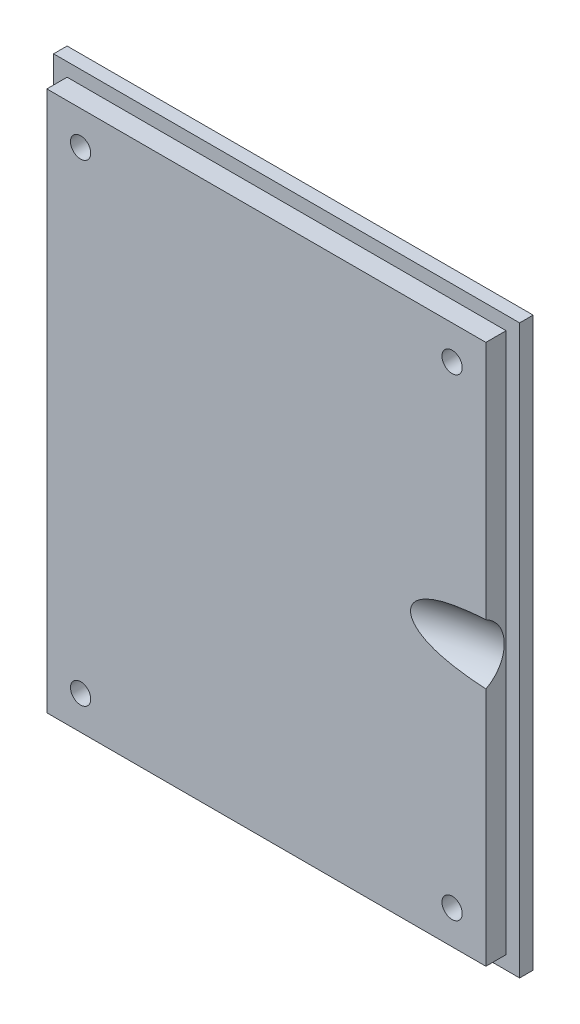
ISO-10303-21;
HEADER;
FILE_DESCRIPTION(('STEP AP214'),'2;1');
FILE_NAME('part.step','',(''),(''),'','','');
FILE_SCHEMA(('AUTOMOTIVE_DESIGN { 1 0 10303 214 1 1 1 1 }'));
ENDSEC;
DATA;
#1=APPLICATION_CONTEXT('core data for automotive mechanical design processes');
#2=APPLICATION_PROTOCOL_DEFINITION('international standard','automotive_design',2000,#1);
#3=PRODUCT_CONTEXT('',#1,'mechanical');
#4=PRODUCT('Part','Part','',(#3));
#5=PRODUCT_RELATED_PRODUCT_CATEGORY('part','',(#4));
#6=PRODUCT_DEFINITION_FORMATION('','',#4);
#7=PRODUCT_DEFINITION_CONTEXT('part definition',#1,'design');
#8=PRODUCT_DEFINITION('design','',#6,#7);
#9=PRODUCT_DEFINITION_SHAPE('','',#8);
#10=(LENGTH_UNIT() NAMED_UNIT(*) SI_UNIT(.MILLI.,.METRE.));
#11=(NAMED_UNIT(*) PLANE_ANGLE_UNIT() SI_UNIT($,.RADIAN.));
#12=(NAMED_UNIT(*) SI_UNIT($,.STERADIAN.) SOLID_ANGLE_UNIT());
#13=UNCERTAINTY_MEASURE_WITH_UNIT(LENGTH_MEASURE(1.E-05),#10,'distance_accuracy_value','');
#14=(GEOMETRIC_REPRESENTATION_CONTEXT(3) GLOBAL_UNCERTAINTY_ASSIGNED_CONTEXT((#13)) GLOBAL_UNIT_ASSIGNED_CONTEXT((#10,
#11,#12)) REPRESENTATION_CONTEXT('',''));
#15=CARTESIAN_POINT('',(0.,0.,0.));
#16=DIRECTION('',(0.,0.,1.));
#17=DIRECTION('',(1.,0.,0.));
#18=AXIS2_PLACEMENT_3D('',#15,#16,#17);
#19=CARTESIAN_POINT('',(-32.5,-40.,5.));
#20=DIRECTION('',(0.,1.,0.));
#21=DIRECTION('',(0.,0.,1.));
#22=AXIS2_PLACEMENT_3D('',#19,#20,#21);
#23=PLANE('',#22);
#24=DIRECTION('',(0.,0.,-1.));
#25=VECTOR('',#24,1.);
#26=CARTESIAN_POINT('',(-32.5,-40.,5.));
#27=LINE('',#26,#25);
#28=CARTESIAN_POINT('',(-32.5,-40.,5.));
#29=VERTEX_POINT('',#28);
#30=CARTESIAN_POINT('',(-32.5,-40.,2.));
#31=VERTEX_POINT('',#30);
#32=EDGE_CURVE('E146',#29,#31,#27,.T.);
#33=ORIENTED_EDGE('',*,*,#32,.T.);
#34=DIRECTION('',(1.,0.,0.));
#35=VECTOR('',#34,1.);
#36=CARTESIAN_POINT('',(0.,-40.,2.));
#37=LINE('',#36,#35);
#38=CARTESIAN_POINT('',(32.5,-40.,2.));
#39=VERTEX_POINT('',#38);
#40=EDGE_CURVE('E71',#31,#39,#37,.T.);
#41=ORIENTED_EDGE('',*,*,#40,.T.);
#42=DIRECTION('',(0.,0.,-1.));
#43=VECTOR('',#42,1.);
#44=CARTESIAN_POINT('',(32.5,-40.,5.));
#45=LINE('',#44,#43);
#46=CARTESIAN_POINT('',(32.5,-40.,5.));
#47=VERTEX_POINT('',#46);
#48=EDGE_CURVE('E58',#47,#39,#45,.T.);
#49=ORIENTED_EDGE('',*,*,#48,.F.);
#50=DIRECTION('',(1.,0.,0.));
#51=VECTOR('',#50,1.);
#52=CARTESIAN_POINT('',(-32.5,-40.,5.));
#53=LINE('',#52,#51);
#54=EDGE_CURVE('E135',#29,#47,#53,.T.);
#55=ORIENTED_EDGE('',*,*,#54,.F.);
#56=EDGE_LOOP('',(#33,#41,#49,#55));
#57=FACE_BOUND('',#56,.T.);
#58=ADVANCED_FACE('F45',(#57),#23,.F.);
#59=CARTESIAN_POINT('',(32.5,-40.,5.));
#60=DIRECTION('',(-1.,0.,0.));
#61=DIRECTION('',(0.,-1.,0.));
#62=AXIS2_PLACEMENT_3D('',#59,#60,#61);
#63=PLANE('',#62);
#64=DIRECTION('',(0.,1.,0.));
#65=VECTOR('',#64,1.);
#66=CARTESIAN_POINT('',(32.5,-40.,5.));
#67=LINE('',#66,#65);
#68=CARTESIAN_POINT('',(32.5,4.44136884406779,5.));
#69=VERTEX_POINT('',#68);
#70=CARTESIAN_POINT('',(32.5,40.,5.));
#71=VERTEX_POINT('',#70);
#72=EDGE_CURVE('E128',#69,#71,#67,.T.);
#73=ORIENTED_EDGE('',*,*,#72,.F.);
#74=CARTESIAN_POINT('',(32.4999979757134,-3.516874652611,3.73385346071111));
#75=CARTESIAN_POINT('',(32.4999981249475,-3.6171821269882,3.8337699571446));
#76=CARTESIAN_POINT('',(32.4999994974993,-3.7132428965186,3.93792892344822));
#77=CARTESIAN_POINT('',(32.500000502642,-3.89625520266674,4.15402293486602));
#78=CARTESIAN_POINT('',(32.5000001347436,-3.98320417056387,4.26596015804758));
#79=CARTESIAN_POINT('',(32.4999998651276,-4.14742708099092,4.496878385669));
#80=CARTESIAN_POINT('',(32.4999999638562,-4.22469169243426,4.61586602325403));
#81=CARTESIAN_POINT('',(32.5000000361572,-4.36894436788852,4.85997491381459));
#82=CARTESIAN_POINT('',(32.5000000096833,-4.43592862402899,4.98509841699587));
#83=CARTESIAN_POINT('',(32.4999999903277,-4.55905714962186,5.2403939297611));
#84=CARTESIAN_POINT('',(32.4999999974079,-4.61521363309605,5.37056004963592));
#85=CARTESIAN_POINT('',(32.500000002593,-4.71642011367928,5.63519528130909));
#86=CARTESIAN_POINT('',(32.5000000006946,-4.76146601359968,5.76966595988538));
#87=CARTESIAN_POINT('',(32.4999999993058,-4.84009834812408,6.04182569298067));
#88=CARTESIAN_POINT('',(32.4999999998139,-4.87369190753094,6.17951268935695));
#89=CARTESIAN_POINT('',(32.5000000001861,-4.92924710919243,6.45726628272309));
#90=CARTESIAN_POINT('',(32.50000000005,-4.95120443783057,6.59733374233348));
#91=CARTESIAN_POINT('',(32.4999999999498,-4.98339622805315,6.87942798304581));
#92=CARTESIAN_POINT('',(32.4999999999865,-4.99357919148764,7.02146064224516));
#93=CARTESIAN_POINT('',(32.5000000000135,-5.00198786039795,7.30593171991061));
#94=CARTESIAN_POINT('',(32.5000000000036,-5.00020914278654,7.44837026900074));
#95=CARTESIAN_POINT('',(32.4999999999964,-4.98470443122162,7.73255246145232));
#96=CARTESIAN_POINT('',(32.499999999999,-4.97098204326742,7.87429630157017));
#97=CARTESIAN_POINT('',(32.500000000001,-4.93168606138697,8.15618479384486));
#98=CARTESIAN_POINT('',(32.5000000000003,-4.90610808724715,8.29632883530815));
#99=CARTESIAN_POINT('',(32.4999999999997,-4.84317666000906,8.57441673210747));
#100=CARTESIAN_POINT('',(32.4999999999999,-4.80578607785502,8.712352189179));
#101=CARTESIAN_POINT('',(32.5000000000001,-4.71950024667184,8.98463022938432));
#102=CARTESIAN_POINT('',(32.5,-4.67060073645046,9.11897146118568));
#103=CARTESIAN_POINT('',(32.5,-4.56165242832222,9.38300852188289));
#104=CARTESIAN_POINT('',(32.5,-4.50160770485095,9.51270602781528));
#105=CARTESIAN_POINT('',(32.5,-4.37078178578848,9.7665841465862));
#106=CARTESIAN_POINT('',(32.5,-4.29999664458931,9.89076271021739));
#107=CARTESIAN_POINT('',(32.5,-4.07248787128145,10.253188966385));
#108=CARTESIAN_POINT('',(32.5,-3.90032848673595,10.4820101269757));
#109=CARTESIAN_POINT('',(32.5,-3.51988267372951,10.9071225556019));
#110=CARTESIAN_POINT('',(32.5,-3.31159748826072,11.1034149424112));
#111=CARTESIAN_POINT('',(32.5,-2.86621412310481,11.4565788559539));
#112=CARTESIAN_POINT('',(32.5,-2.62932384459324,11.6137120850903));
#113=CARTESIAN_POINT('',(32.5,-2.13233243378857,11.8855244579747));
#114=CARTESIAN_POINT('',(32.5,-1.87223257436095,12.0002059280987));
#115=CARTESIAN_POINT('',(32.5,-1.33884081874991,12.1827441174686));
#116=CARTESIAN_POINT('',(32.5,-1.06569701871864,12.2510335918701));
#117=CARTESIAN_POINT('',(32.5,-0.511798107779041,12.3404305262509));
#118=CARTESIAN_POINT('',(32.5,-0.231043356422543,12.3615402111508));
#119=CARTESIAN_POINT('',(32.5,0.32805462763993,12.3559522226046));
#120=CARTESIAN_POINT('',(32.5,0.606401190018648,12.3295815517884));
#121=CARTESIAN_POINT('',(32.5,1.15470730130728,12.2304735258888));
#122=CARTESIAN_POINT('',(32.5,1.42466692663318,12.1577365933928));
#123=CARTESIAN_POINT('',(32.5,1.94856914976691,11.9680959765911));
#124=CARTESIAN_POINT('',(32.5,2.20251278434363,11.8511951545939));
#125=CARTESIAN_POINT('',(32.5,2.6873502364433,11.5766935061829));
#126=CARTESIAN_POINT('',(32.5,2.91824335688695,11.4190914494245));
#127=CARTESIAN_POINT('',(32.5,3.35212341307692,11.0665820546904));
#128=CARTESIAN_POINT('',(32.5,3.55491266179812,10.8714314478945));
#129=CARTESIAN_POINT('',(32.5,3.92522581281354,10.4501361521947));
#130=CARTESIAN_POINT('',(32.5,4.09274796169792,10.2239899231727));
#131=CARTESIAN_POINT('',(32.5,4.38942245907388,9.74483683000219));
#132=CARTESIAN_POINT('',(32.5,4.51819931693697,9.49159745149484));
#133=CARTESIAN_POINT('',(32.5,4.73175528083807,8.96719995296679));
#134=CARTESIAN_POINT('',(32.5,4.81653251946085,8.69604107296389));
#135=CARTESIAN_POINT('',(32.5,4.94022345439426,8.14143825450735));
#136=CARTESIAN_POINT('',(32.5,4.97880888369239,7.85792105509537));
#137=CARTESIAN_POINT('',(32.5,5.00793192631867,7.28842510052362));
#138=CARTESIAN_POINT('',(32.5,4.99846869703963,7.00244630228372));
#139=CARTESIAN_POINT('',(32.5,4.9316418364214,6.43560769372061));
#140=CARTESIAN_POINT('',(32.5,4.87419098393685,6.15475815672452));
#141=CARTESIAN_POINT('',(32.5,4.71278923679523,5.60673943680414));
#142=CARTESIAN_POINT('',(32.5,4.60883893536106,5.33957007940161));
#143=CARTESIAN_POINT('',(32.5,4.35773944290128,4.82750553697763));
#144=CARTESIAN_POINT('',(32.5,4.21073425253095,4.58253961071515));
#145=CARTESIAN_POINT('',(32.5,3.87731157798399,4.12087478741439));
#146=CARTESIAN_POINT('',(32.5,3.69089525019269,3.90417506130251));
#147=CARTESIAN_POINT('',(32.5,3.38661999914296,3.60596720644367));
#148=CARTESIAN_POINT('',(32.5,3.28139333188492,3.51125102837838));
#149=CARTESIAN_POINT('',(32.5,3.06331128068612,3.33107519250852));
#150=CARTESIAN_POINT('',(32.5,2.95045881169792,3.24561202989589));
#151=CARTESIAN_POINT('',(32.5,2.71787816466228,3.08454401218533));
#152=CARTESIAN_POINT('',(32.5,2.59814759264898,3.00894261984981));
#153=CARTESIAN_POINT('',(32.5,2.35274085480321,2.86820864177198));
#154=CARTESIAN_POINT('',(32.5,2.22706695546945,2.80307210624801));
#155=CARTESIAN_POINT('',(32.5,1.97142111582366,2.68408587451887));
#156=CARTESIAN_POINT('',(32.5000000000001,1.84148016040701,2.6301695895228));
#157=CARTESIAN_POINT('',(32.4999999999999,1.57755242962669,2.53354016753895));
#158=CARTESIAN_POINT('',(32.4999999999998,1.44356720224795,2.49082280319967));
#159=CARTESIAN_POINT('',(32.5000000000002,1.17242001820544,2.41686905887265));
#160=CARTESIAN_POINT('',(32.5000000000008,1.03525708890694,2.38563624479068));
#161=CARTESIAN_POINT('',(32.4999999999992,0.758829948227324,2.33491116293828));
#162=CARTESIAN_POINT('',(32.4999999999969,0.619566541668243,2.31541450986564));
#163=CARTESIAN_POINT('',(32.5000000000031,0.3404823034997,2.28834569232074));
#164=CARTESIAN_POINT('',(32.5000000000115,0.200666340952009,2.28072330527807));
#165=CARTESIAN_POINT('',(32.4999999999885,-0.0790581208254349,2.27730165717199));
#166=CARTESIAN_POINT('',(32.4999999999571,-0.218966566102274,2.28149798808714));
#167=CARTESIAN_POINT('',(32.5000000000429,-0.498016288028657,2.30167964903476));
#168=CARTESIAN_POINT('',(32.5000000001601,-0.63715704529949,2.31767216057601));
#169=CARTESIAN_POINT('',(32.4999999998399,-0.913542688765869,2.36132855833972));
#170=CARTESIAN_POINT('',(32.4999999994027,-1.05078825315074,2.38898815155321));
#171=CARTESIAN_POINT('',(32.5000000005971,-1.3224135120005,2.45576358729008));
#172=CARTESIAN_POINT('',(32.5000000022279,-1.45679417316671,2.49487549766725));
#173=CARTESIAN_POINT('',(32.4999999977729,-1.72173714527039,2.58425587710943));
#174=CARTESIAN_POINT('',(32.4999999916899,-1.85230082810006,2.63452028055319));
#175=CARTESIAN_POINT('',(32.5000000083026,-2.10862623722175,2.74579851580137));
#176=CARTESIAN_POINT('',(32.5000000309725,-2.23439217849113,2.80680263484359));
#177=CARTESIAN_POINT('',(32.4999999690357,-2.48032355243891,2.93912397088406));
#178=CARTESIAN_POINT('',(32.4999998844575,-2.60049046278283,3.01043844621033));
#179=CARTESIAN_POINT('',(32.500000142093,-2.86133182907438,3.18041916331689));
#180=CARTESIAN_POINT('',(32.5000005868452,-3.00037348724913,3.28160491760796));
#181=CARTESIAN_POINT('',(32.499999413156,-3.26731718847826,3.49773147407023));
#182=CARTESIAN_POINT('',(32.4999977947187,-3.39521925338495,3.61267224925745));
#183=CARTESIAN_POINT('',(32.4999979757134,-3.516874652611,3.73385346071111));
#184=B_SPLINE_CURVE_WITH_KNOTS('',3,(#74,#75,#76,#77,#78,#79,#80,#81,#82,#83,#84,#85,#86,#87,
#88,#89,#90,#91,#92,#93,#94,#95,#96,#97,#98,#99,#100,#101,#102,#103,#104,#105,#106,#107,#108,
#109,#110,#111,#112,#113,#114,#115,#116,#117,#118,#119,#120,#121,#122,#123,#124,#125,#126,#127,
#128,#129,#130,#131,#132,#133,#134,#135,#136,#137,#138,#139,#140,#141,#142,#143,#144,#145,#146,
#147,#148,#149,#150,#151,#152,#153,#154,#155,#156,#157,#158,#159,#160,#161,#162,#163,#164,#165,
#166,#167,#168,#169,#170,#171,#172,#173,#174,#175,#176,#177,#178,#179,#180,#181,#182,#183),
.UNSPECIFIED.,.T.,.F.,(4,2,2,2,2,2,2,2,2,2,2,2,2,2,2,2,2,2,2,2,2,2,2,2,2,2,2,2,2,2,2,2,2,2,2,2,
2,2,2,2,2,2,2,2,2,2,2,2,2,2,2,2,2,2,4),(0.,0.424588292912044,0.849295961909985,1.2744097505481,
1.69968062437603,2.12446893800834,2.54941366506714,2.97409353829083,3.39893073281214,
3.82561911387645,4.25246528076314,4.67918262014399,5.10605774208933,5.53428818343303,
5.96267742765055,6.39091036988927,6.81930101069769,7.67389342975139,8.52845645039716,
9.37714523754839,10.2257875092746,11.0664005600881,11.9069739681497,12.7417803781225,
13.5765791796829,14.4113238863292,15.2460938291635,16.0864661760144,16.9268802946391,
17.7751945538913,18.6235448140334,19.4778888399408,20.3322478481377,21.1881631062646,
22.0440674452502,22.8971412091028,23.7501899458898,24.1745022531405,24.5986532751756,
25.0229528307041,25.4470918634611,25.8686370663418,26.2900229151164,26.7115394922082,
27.1328984686283,27.5524704085024,27.9718858815609,28.3915569055169,28.8110736422194,
29.2304465066684,29.6496667399522,30.0685097692938,30.4872416264072,31.0021938762929,
31.5171451159851),.UNSPECIFIED.);
#185=CARTESIAN_POINT('',(32.5,-4.44136884406779,5.));
#186=VERTEX_POINT('',#185);
#187=EDGE_CURVE('E63',#69,#186,#184,.T.);
#188=ORIENTED_EDGE('',*,*,#187,.T.);
#189=EDGE_CURVE('E125',#47,#186,#67,.T.);
#190=ORIENTED_EDGE('',*,*,#189,.F.);
#191=ORIENTED_EDGE('',*,*,#48,.T.);
#192=DIRECTION('',(0.,1.,0.));
#193=VECTOR('',#192,1.);
#194=CARTESIAN_POINT('',(32.5,0.,2.));
#195=LINE('',#194,#193);
#196=CARTESIAN_POINT('',(32.5,40.,2.));
#197=VERTEX_POINT('',#196);
#198=EDGE_CURVE('E153',#39,#197,#195,.T.);
#199=ORIENTED_EDGE('',*,*,#198,.T.);
#200=DIRECTION('',(0.,0.,-1.));
#201=VECTOR('',#200,1.);
#202=CARTESIAN_POINT('',(32.5,40.,5.));
#203=LINE('',#202,#201);
#204=EDGE_CURVE('E150',#71,#197,#203,.T.);
#205=ORIENTED_EDGE('',*,*,#204,.F.);
#206=EDGE_LOOP('',(#73,#188,#190,#191,#199,#205));
#207=FACE_BOUND('',#206,.T.);
#208=ADVANCED_FACE('F124',(#207),#63,.F.);
#209=CARTESIAN_POINT('',(-32.5,40.,5.));
#210=DIRECTION('',(0.,1.,0.));
#211=DIRECTION('',(-1.,0.,0.));
#212=AXIS2_PLACEMENT_3D('',#209,#210,#211);
#213=PLANE('',#212);
#214=DIRECTION('',(1.,0.,0.));
#215=VECTOR('',#214,1.);
#216=CARTESIAN_POINT('',(0.,40.,2.));
#217=LINE('',#216,#215);
#218=CARTESIAN_POINT('',(-32.5,40.,2.));
#219=VERTEX_POINT('',#218);
#220=EDGE_CURVE('E160',#219,#197,#217,.T.);
#221=ORIENTED_EDGE('',*,*,#220,.F.);
#222=DIRECTION('',(0.,0.,-1.));
#223=VECTOR('',#222,1.);
#224=CARTESIAN_POINT('',(-32.5,40.,5.));
#225=LINE('',#224,#223);
#226=CARTESIAN_POINT('',(-32.5,40.,5.));
#227=VERTEX_POINT('',#226);
#228=EDGE_CURVE('E148',#227,#219,#225,.T.);
#229=ORIENTED_EDGE('',*,*,#228,.F.);
#230=DIRECTION('',(1.,0.,0.));
#231=VECTOR('',#230,1.);
#232=CARTESIAN_POINT('',(-32.5,40.,5.));
#233=LINE('',#232,#231);
#234=EDGE_CURVE('E136',#227,#71,#233,.T.);
#235=ORIENTED_EDGE('',*,*,#234,.T.);
#236=ORIENTED_EDGE('',*,*,#204,.T.);
#237=EDGE_LOOP('',(#221,#229,#235,#236));
#238=FACE_BOUND('',#237,.T.);
#239=ADVANCED_FACE('F226',(#238),#213,.T.);
#240=CARTESIAN_POINT('',(-32.5,-40.,5.));
#241=DIRECTION('',(-1.,0.,0.));
#242=DIRECTION('',(0.,0.,1.));
#243=AXIS2_PLACEMENT_3D('',#240,#241,#242);
#244=PLANE('',#243);
#245=DIRECTION('',(0.,1.,0.));
#246=VECTOR('',#245,1.);
#247=CARTESIAN_POINT('',(-32.5,0.,2.));
#248=LINE('',#247,#246);
#249=EDGE_CURVE('E166',#31,#219,#248,.T.);
#250=ORIENTED_EDGE('',*,*,#249,.F.);
#251=ORIENTED_EDGE('',*,*,#32,.F.);
#252=DIRECTION('',(0.,1.,0.));
#253=VECTOR('',#252,1.);
#254=CARTESIAN_POINT('',(-32.5,-40.,5.));
#255=LINE('',#254,#253);
#256=EDGE_CURVE('E139',#29,#227,#255,.T.);
#257=ORIENTED_EDGE('',*,*,#256,.T.);
#258=ORIENTED_EDGE('',*,*,#228,.T.);
#259=EDGE_LOOP('',(#250,#251,#257,#258));
#260=FACE_BOUND('',#259,.T.);
#261=ADVANCED_FACE('F228',(#260),#244,.T.);
#262=CARTESIAN_POINT('',(0.,0.,5.));
#263=DIRECTION('',(0.,0.,1.));
#264=DIRECTION('',(1.,0.,0.));
#265=AXIS2_PLACEMENT_3D('',#262,#263,#264);
#266=PLANE('',#265);
#267=CARTESIAN_POINT('',(27.5,-35.,5.));
#268=DIRECTION('',(0.,0.,1.));
#269=DIRECTION('',(1.,0.,0.));
#270=AXIS2_PLACEMENT_3D('',#267,#268,#269);
#271=CIRCLE('',#270,1.5);
#272=CARTESIAN_POINT('',(29.,-35.,5.));
#273=VERTEX_POINT('',#272);
#274=EDGE_CURVE('E130',#273,#273,#271,.T.);
#275=ORIENTED_EDGE('',*,*,#274,.F.);
#276=EDGE_LOOP('',(#275));
#277=FACE_BOUND('',#276,.T.);
#278=CARTESIAN_POINT('',(-27.5,-35.,5.));
#279=DIRECTION('',(0.,0.,1.));
#280=DIRECTION('',(1.,0.,0.));
#281=AXIS2_PLACEMENT_3D('',#278,#279,#280);
#282=CIRCLE('',#281,1.5);
#283=CARTESIAN_POINT('',(-26.,-35.,5.));
#284=VERTEX_POINT('',#283);
#285=EDGE_CURVE('E280',#284,#284,#282,.T.);
#286=ORIENTED_EDGE('',*,*,#285,.F.);
#287=EDGE_LOOP('',(#286));
#288=FACE_BOUND('',#287,.T.);
#289=CARTESIAN_POINT('',(-27.5,35.,5.));
#290=DIRECTION('',(0.,0.,1.));
#291=DIRECTION('',(1.,0.,0.));
#292=AXIS2_PLACEMENT_3D('',#289,#290,#291);
#293=CIRCLE('',#292,1.5);
#294=CARTESIAN_POINT('',(-26.,35.,5.));
#295=VERTEX_POINT('',#294);
#296=EDGE_CURVE('E261',#295,#295,#293,.T.);
#297=ORIENTED_EDGE('',*,*,#296,.F.);
#298=EDGE_LOOP('',(#297));
#299=FACE_BOUND('',#298,.T.);
#300=CARTESIAN_POINT('',(27.5,35.,5.));
#301=DIRECTION('',(0.,0.,1.));
#302=DIRECTION('',(1.,0.,0.));
#303=AXIS2_PLACEMENT_3D('',#300,#301,#302);
#304=CIRCLE('',#303,1.5);
#305=CARTESIAN_POINT('',(29.,35.,5.));
#306=VERTEX_POINT('',#305);
#307=EDGE_CURVE('E270',#306,#306,#304,.T.);
#308=ORIENTED_EDGE('',*,*,#307,.F.);
#309=EDGE_LOOP('',(#308));
#310=FACE_BOUND('',#309,.T.);
#311=CARTESIAN_POINT('',(52.6558443707464,1.83561105481302,5.));
#312=CARTESIAN_POINT('',(52.5737148612363,1.90619296503915,5.));
#313=CARTESIAN_POINT('',(52.4891116073405,1.97378906228447,5.));
#314=CARTESIAN_POINT('',(52.3159303022378,2.10350042620041,5.));
#315=CARTESIAN_POINT('',(52.2273565479426,2.16562141190841,5.));
#316=CARTESIAN_POINT('',(52.0474172021252,2.28476354522464,5.));
#317=CARTESIAN_POINT('',(51.9560652514872,2.34180547127826,5.));
#318=CARTESIAN_POINT('',(51.7707827815188,2.45157779134348,5.));
#319=CARTESIAN_POINT('',(51.6768514957516,2.50430688488839,5.));
#320=CARTESIAN_POINT('',(51.3953402149125,2.65484632624566,5.));
#321=CARTESIAN_POINT('',(51.2047832522632,2.7471073258244,5.));
#322=CARTESIAN_POINT('',(50.8179959101407,2.9193427950116,5.));
#323=CARTESIAN_POINT('',(50.6217582303496,2.99930053761165,5.));
#324=CARTESIAN_POINT('',(50.1518571050608,3.17658771600231,5.));
#325=CARTESIAN_POINT('',(49.8764789296329,3.26935666098378,5.));
#326=CARTESIAN_POINT('',(49.3209180508561,3.43933880428353,5.));
#327=CARTESIAN_POINT('',(49.0407330852568,3.51654444717197,5.));
#328=CARTESIAN_POINT('',(48.4769069359302,3.65828179285345,5.));
#329=CARTESIAN_POINT('',(48.1932625357492,3.72280056518377,5.));
#330=CARTESIAN_POINT('',(47.6237666549316,3.84126017765177,5.));
#331=CARTESIAN_POINT('',(47.3379149194201,3.89519977666908,5.));
#332=CARTESIAN_POINT('',(46.7589300547261,3.99519609655886,5.));
#333=CARTESIAN_POINT('',(46.4657660945496,4.04107248862638,5.));
#334=CARTESIAN_POINT('',(45.878324987866,4.12503185631241,5.));
#335=CARTESIAN_POINT('',(45.5840477982942,4.16311452722889,5.));
#336=CARTESIAN_POINT('',(44.9950288541893,4.23261207999385,5.));
#337=CARTESIAN_POINT('',(44.7002879140713,4.26403393430138,5.));
#338=CARTESIAN_POINT('',(44.1102668996281,4.32120480744591,5.));
#339=CARTESIAN_POINT('',(43.8149868336445,4.34695391331725,5.));
#340=CARTESIAN_POINT('',(43.1729697092692,4.39758351356227,5.));
#341=CARTESIAN_POINT('',(42.826160616668,4.42154452292055,5.));
#342=CARTESIAN_POINT('',(42.1321889564023,4.46373215143646,5.));
#343=CARTESIAN_POINT('',(41.7850263781238,4.48195859298635,5.));
#344=CARTESIAN_POINT('',(41.090430489041,4.51344543398709,5.));
#345=CARTESIAN_POINT('',(40.7429971472443,4.52670514086123,5.));
#346=CARTESIAN_POINT('',(40.0479871197414,4.54882306881996,5.));
#347=CARTESIAN_POINT('',(39.7004104319108,4.55768122213753,5.));
#348=CARTESIAN_POINT('',(39.0044331964172,4.5713951953669,5.));
#349=CARTESIAN_POINT('',(38.6560324811339,4.57624238739797,5.));
#350=CARTESIAN_POINT('',(37.9591952711582,4.58211631585003,5.));
#351=CARTESIAN_POINT('',(37.6107587760967,4.58314300781433,5.));
#352=CARTESIAN_POINT('',(36.9139450811492,4.58142140242078,5.));
#353=CARTESIAN_POINT('',(36.5655678799411,4.57867364782529,5.));
#354=CARTESIAN_POINT('',(35.8688694847532,4.56928267464571,5.));
#355=CARTESIAN_POINT('',(35.5205482901361,4.56263950406399,5.));
#356=CARTESIAN_POINT('',(34.8279238217026,4.54526411709231,5.));
#357=CARTESIAN_POINT('',(34.4836193897259,4.53457869775268,5.));
#358=CARTESIAN_POINT('',(33.7951851538115,4.50866146380066,5.));
#359=CARTESIAN_POINT('',(33.4510553469921,4.49342972682479,5.));
#360=CARTESIAN_POINT('',(32.7629164227228,4.45777671361025,5.));
#361=CARTESIAN_POINT('',(32.4189074162545,4.43735326566391,5.));
#362=CARTESIAN_POINT('',(31.7312997590968,4.39047984740062,5.));
#363=CARTESIAN_POINT('',(31.3877011022206,4.36402996912503,5.));
#364=CARTESIAN_POINT('',(30.7022263244072,4.30412344551377,5.));
#365=CARTESIAN_POINT('',(30.3603482256508,4.27068972587798,5.));
#366=CARTESIAN_POINT('',(29.6774806650399,4.19541261316078,5.));
#367=CARTESIAN_POINT('',(29.3364912673504,4.15356862900796,5.));
#368=CARTESIAN_POINT('',(28.6561543154048,4.0598001247536,5.));
#369=CARTESIAN_POINT('',(28.3168056993335,4.00788338937031,5.));
#370=CARTESIAN_POINT('',(27.6402355360287,3.89178621941212,5.));
#371=CARTESIAN_POINT('',(27.3030135556711,3.82760837120215,5.));
#372=CARTESIAN_POINT('',(26.8221579439824,3.72481650022733,5.));
#373=CARTESIAN_POINT('',(26.6772031772214,3.69234783683178,5.));
#374=CARTESIAN_POINT('',(26.388028236343,3.62427838705663,5.));
#375=CARTESIAN_POINT('',(26.2438080747042,3.58867754765763,5.));
#376=CARTESIAN_POINT('',(25.8122992676925,3.47666107571903,5.));
#377=CARTESIAN_POINT('',(25.5263282938654,3.39506619396757,5.));
#378=CARTESIAN_POINT('',(24.9597842248459,3.21489917554103,5.));
#379=CARTESIAN_POINT('',(24.6792089347544,3.11633411179338,5.));
#380=CARTESIAN_POINT('',(24.2648193681647,2.95243362168725,5.));
#381=CARTESIAN_POINT('',(24.1278146609834,2.89514722151166,5.));
#382=CARTESIAN_POINT('',(23.8565308533153,2.77447390868267,5.));
#383=CARTESIAN_POINT('',(23.7222512103275,2.71108822498058,5.));
#384=CARTESIAN_POINT('',(23.456071667506,2.57678195658306,5.));
#385=CARTESIAN_POINT('',(23.32420127231,2.50580249537055,5.));
#386=CARTESIAN_POINT('',(23.0652126671185,2.35570549624436,5.));
#387=CARTESIAN_POINT('',(22.9380923309359,2.27659166034485,5.));
#388=CARTESIAN_POINT('',(22.6906855037313,2.10924876213195,5.));
#389=CARTESIAN_POINT('',(22.5703734169688,2.02105792046874,5.));
#390=CARTESIAN_POINT('',(22.3385297995492,1.83390729850666,5.));
#391=CARTESIAN_POINT('',(22.2269881162762,1.7349602954948,5.));
#392=CARTESIAN_POINT('',(22.0279891749625,1.53651336908171,5.));
#393=CARTESIAN_POINT('',(21.9392342474893,1.43833081565375,5.));
#394=CARTESIAN_POINT('',(21.7748772741063,1.23124088612605,5.));
#395=CARTESIAN_POINT('',(21.6992817096507,1.12232826620906,5.));
#396=CARTESIAN_POINT('',(21.5652746394898,0.892212368759751,5.));
#397=CARTESIAN_POINT('',(21.5071020503863,0.770866364450886,5.));
#398=CARTESIAN_POINT('',(21.4154072792764,0.51921259051274,5.));
#399=CARTESIAN_POINT('',(21.3818248216192,0.388927596332765,5.));
#400=CARTESIAN_POINT('',(21.3460799533482,0.139424314834985,5.));
#401=CARTESIAN_POINT('',(21.3407348424352,0.0206672117130276,5.));
#402=CARTESIAN_POINT('',(21.3535683071778,-0.215580900129967,5.));
#403=CARTESIAN_POINT('',(21.3717518703016,-0.33307163509003,5.));
#404=CARTESIAN_POINT('',(21.4254601588697,-0.546982950388944,5.));
#405=CARTESIAN_POINT('',(21.4583049360462,-0.644103132011713,5.));
#406=CARTESIAN_POINT('',(21.5373737796055,-0.832651922006893,5.));
#407=CARTESIAN_POINT('',(21.5836003032623,-0.924079481299898,5.));
#408=CARTESIAN_POINT('',(21.7205236188376,-1.15811902450344,5.));
#409=CARTESIAN_POINT('',(21.8205654139608,-1.29524335257105,5.));
#410=CARTESIAN_POINT('',(22.0404607449028,-1.55261286962179,5.));
#411=CARTESIAN_POINT('',(22.160377018299,-1.67280230358174,5.));
#412=CARTESIAN_POINT('',(22.401183357186,-1.88729783549875,5.));
#413=CARTESIAN_POINT('',(22.5208683520198,-1.98298181132209,5.));
#414=CARTESIAN_POINT('',(22.7680095557932,-2.16383004943475,5.));
#415=CARTESIAN_POINT('',(22.8954724615305,-2.24898504980064,5.));
#416=CARTESIAN_POINT('',(23.1562195963462,-2.41032483490917,5.));
#417=CARTESIAN_POINT('',(23.2895139774792,-2.48649304737719,5.));
#418=CARTESIAN_POINT('',(23.5602297766749,-2.63090581657626,5.));
#419=CARTESIAN_POINT('',(23.6976497173377,-2.69915316822324,5.));
#420=CARTESIAN_POINT('',(24.0401758543347,-2.85889717148576,5.));
#421=CARTESIAN_POINT('',(24.2471004478099,-2.94648673527348,5.));
#422=CARTESIAN_POINT('',(24.665690305258,-3.10961124926073,5.));
#423=CARTESIAN_POINT('',(24.8773578826804,-3.18514016406043,5.));
#424=CARTESIAN_POINT('',(25.304383785287,-3.32617965037364,5.));
#425=CARTESIAN_POINT('',(25.5197478523274,-3.39167269758263,5.));
#426=CARTESIAN_POINT('',(25.9529182131677,-3.51403190608236,5.));
#427=CARTESIAN_POINT('',(26.1707247979968,-3.57089702735986,5.));
#428=CARTESIAN_POINT('',(26.6092829681986,-3.67750429894145,5.));
#429=CARTESIAN_POINT('',(26.8300440395059,-3.7272071532312,5.));
#430=CARTESIAN_POINT('',(27.2729201795097,-3.82013813082315,5.));
#431=CARTESIAN_POINT('',(27.4950352943646,-3.86336603209973,5.));
#432=CARTESIAN_POINT('',(28.1624100180418,-3.98453783880043,5.));
#433=CARTESIAN_POINT('',(28.6091977687932,-4.05408661528502,5.));
#434=CARTESIAN_POINT('',(29.5323776586464,-4.17964903591883,5.));
#435=CARTESIAN_POINT('',(30.0089120848938,-4.23457728872962,5.));
#436=CARTESIAN_POINT('',(30.9635169459503,-4.32937259711096,5.));
#437=CARTESIAN_POINT('',(31.441587603384,-4.36923736036255,5.));
#438=CARTESIAN_POINT('',(32.3989605099113,-4.43707241986672,5.));
#439=CARTESIAN_POINT('',(32.8782634638526,-4.46503247897432,5.));
#440=CARTESIAN_POINT('',(33.8372973443655,-4.51124942953174,5.));
#441=CARTESIAN_POINT('',(34.3170282447561,-4.52950687857486,5.));
#442=CARTESIAN_POINT('',(35.2750660126163,-4.55776767436692,5.));
#443=CARTESIAN_POINT('',(35.7533720678397,-4.56779934566786,5.));
#444=CARTESIAN_POINT('',(36.7100877579494,-4.580545919479,5.));
#445=CARTESIAN_POINT('',(37.188497394565,-4.58326068859193,5.));
#446=CARTESIAN_POINT('',(38.145079523474,-4.58160160402092,5.));
#447=CARTESIAN_POINT('',(38.6232520213753,-4.57723108701774,5.));
#448=CARTESIAN_POINT('',(39.5794624311221,-4.56104039206397,5.));
#449=CARTESIAN_POINT('',(40.0575003459669,-4.54922039589976,5.));
#450=CARTESIAN_POINT('',(41.0730722940917,-4.51515806446126,5.));
#451=CARTESIAN_POINT('',(41.6105699145298,-4.49179711625188,5.));
#452=CARTESIAN_POINT('',(42.6849617659889,-4.43204627332908,5.));
#453=CARTESIAN_POINT('',(43.2218558905712,-4.39565435969123,5.));
#454=CARTESIAN_POINT('',(44.0268917776505,-4.32846134490919,5.));
#455=CARTESIAN_POINT('',(44.2955583829274,-4.30392001362778,5.));
#456=CARTESIAN_POINT('',(44.8324030800475,-4.2500038317657,5.));
#457=CARTESIAN_POINT('',(45.1005811864939,-4.22062912815266,5.));
#458=CARTESIAN_POINT('',(45.6362263307486,-4.15632446753776,5.));
#459=CARTESIAN_POINT('',(45.9036934910382,-4.12139554028242,5.));
#460=CARTESIAN_POINT('',(46.4376993415982,-4.04509439724057,5.));
#461=CARTESIAN_POINT('',(46.7042380756562,-4.00372248965016,5.));
#462=CARTESIAN_POINT('',(47.2873711517752,-3.9047591560628,5.));
#463=CARTESIAN_POINT('',(47.6037006215005,-3.8455784380697,5.));
#464=CARTESIAN_POINT('',(48.2336165730722,-3.7142574745665,5.));
#465=CARTESIAN_POINT('',(48.547203611098,-3.64211992383554,5.));
#466=CARTESIAN_POINT('',(49.1681843707895,-3.48243246884023,5.));
#467=CARTESIAN_POINT('',(49.4756061226927,-3.39499437715761,5.));
#468=CARTESIAN_POINT('',(49.93200263801,-3.24900872371518,5.));
#469=CARTESIAN_POINT('',(50.0833550143029,-3.19787166399874,5.));
#470=CARTESIAN_POINT('',(50.3840429033833,-3.08998761700007,5.));
#471=CARTESIAN_POINT('',(50.5333786156735,-3.03324118932566,5.));
#472=CARTESIAN_POINT('',(50.8571687058244,-2.90215941383972,5.));
#473=CARTESIAN_POINT('',(51.0310992088874,-2.82651917905032,5.));
#474=CARTESIAN_POINT('',(51.3738471206366,-2.66472617154468,5.));
#475=CARTESIAN_POINT('',(51.5426699708928,-2.57858511651769,5.));
#476=CARTESIAN_POINT('',(51.791575595389,-2.43940264679674,5.));
#477=CARTESIAN_POINT('',(51.8742838155619,-2.39104038806102,5.));
#478=CARTESIAN_POINT('',(52.0375119615122,-2.29077876348358,5.));
#479=CARTESIAN_POINT('',(52.1180323847861,-2.23888021135783,5.));
#480=CARTESIAN_POINT('',(52.2767173299063,-2.13100644984327,5.));
#481=CARTESIAN_POINT('',(52.3548728198107,-2.07501786313091,5.));
#482=CARTESIAN_POINT('',(52.5079581300718,-1.95867872902109,5.));
#483=CARTESIAN_POINT('',(52.5828852917872,-1.89832469208683,5.));
#484=CARTESIAN_POINT('',(52.6558443707464,-1.83561105481302,5.));
#485=B_SPLINE_CURVE_WITH_KNOTS('',3,(#311,#312,#313,#314,#315,#316,#317,#318,#319,#320,#321,
#322,#323,#324,#325,#326,#327,#328,#329,#330,#331,#332,#333,#334,#335,#336,#337,#338,#339,#340,
#341,#342,#343,#344,#345,#346,#347,#348,#349,#350,#351,#352,#353,#354,#355,#356,#357,#358,#359,
#360,#361,#362,#363,#364,#365,#366,#367,#368,#369,#370,#371,#372,#373,#374,#375,#376,#377,#378,
#379,#380,#381,#382,#383,#384,#385,#386,#387,#388,#389,#390,#391,#392,#393,#394,#395,#396,#397,
#398,#399,#400,#401,#402,#403,#404,#405,#406,#407,#408,#409,#410,#411,#412,#413,#414,#415,#416,
#417,#418,#419,#420,#421,#422,#423,#424,#425,#426,#427,#428,#429,#430,#431,#432,#433,#434,#435,
#436,#437,#438,#439,#440,#441,#442,#443,#444,#445,#446,#447,#448,#449,#450,#451,#452,#453,#454,
#455,#456,#457,#458,#459,#460,#461,#462,#463,#464,#465,#466,#467,#468,#469,#470,#471,#472,#473,
#474,#475,#476,#477,#478,#479,#480,#481,#482,#483,#484),.UNSPECIFIED.,.F.,.F.,(4,2,2,2,2,2,2,2,
2,2,2,2,2,2,2,2,2,2,2,2,2,2,2,2,2,2,2,2,2,2,2,2,2,2,2,2,2,2,2,2,2,2,2,2,2,2,2,2,2,2,2,2,2,2,2,2,
2,2,2,2,2,2,2,2,2,2,2,2,2,2,2,2,2,2,2,2,2,2,2,2,2,2,2,2,2,2,4),(0.,0.324703815691992,
0.649064339086194,0.972030271468481,1.29509323284849,1.92962737809599,2.56501672949322,
3.43613439951961,4.30767395312059,5.1800972277856,6.05262279167719,6.94269400261895,
7.83280000499169,8.72196960352851,9.61112555900053,10.6539754274517,11.6968575912701,
12.739885123683,13.7829287142171,14.8282101802858,15.873503809579,16.918647142232,
17.9637775960836,18.9971615497257,20.0305278574965,21.0643271387285,22.0981106318555,
23.1285524271722,24.1590666670342,25.1887876246254,26.218291611739,26.6639016752041,
27.109519283111,28.0012627547544,28.8926354563123,29.3380139225256,29.7833028361095,
30.2323360201686,30.6811657429361,31.1281774146433,31.5746637651415,31.9708642996019,
32.3672594281408,32.7688645485822,33.1694819233936,33.5237994903715,33.8781921757804,
34.1846224922266,34.4911091138337,34.9973965373573,35.5053137057275,35.964334741297,
36.4237567294459,36.8840131038784,37.3441065775633,38.0176992756674,38.6916280043138,
39.3667204346919,40.0418941764111,40.7206417005264,41.3994124935164,42.755419306417,
44.1942014758565,45.6332025069776,47.073438483096,48.513591682231,49.9487647989065,
51.3839640805998,52.8184876787972,54.2529762722966,55.8668735355358,57.4810209527236,
58.2903414326641,59.0996373082627,59.9087833159222,60.7178906304496,61.6831143451294,
62.6481375432761,63.6063825835248,64.0855665824289,64.5647028246161,65.1334210894259,
65.7015104425509,65.9888669056321,66.2761574686315,66.5644338220619,66.8529432124883),.UNSPECIFIED.);
#486=EDGE_CURVE('E12',#69,#186,#485,.T.);
#487=ORIENTED_EDGE('',*,*,#486,.F.);
#488=ORIENTED_EDGE('',*,*,#72,.T.);
#489=ORIENTED_EDGE('',*,*,#234,.F.);
#490=ORIENTED_EDGE('',*,*,#256,.F.);
#491=ORIENTED_EDGE('',*,*,#54,.T.);
#492=ORIENTED_EDGE('',*,*,#189,.T.);
#493=EDGE_LOOP('',(#487,#488,#489,#490,#491,#492));
#494=FACE_BOUND('',#493,.T.);
#495=ADVANCED_FACE('F132',(#277,#288,#299,#310,#494),#266,.T.);
#496=CARTESIAN_POINT('',(-34.5,0.,2.));
#497=DIRECTION('',(-1.,0.,0.));
#498=DIRECTION('',(0.,0.,1.));
#499=AXIS2_PLACEMENT_3D('',#496,#497,#498);
#500=PLANE('',#499);
#501=DIRECTION('',(0.,1.,0.));
#502=VECTOR('',#501,1.);
#503=CARTESIAN_POINT('',(-34.5,0.,0.));
#504=LINE('',#503,#502);
#505=CARTESIAN_POINT('',(-34.5,-42.,0.));
#506=VERTEX_POINT('',#505);
#507=CARTESIAN_POINT('',(-34.5,42.,0.));
#508=VERTEX_POINT('',#507);
#509=EDGE_CURVE('E129',#506,#508,#504,.T.);
#510=ORIENTED_EDGE('',*,*,#509,.F.);
#511=DIRECTION('',(0.,0.,-1.));
#512=VECTOR('',#511,1.);
#513=CARTESIAN_POINT('',(-34.5,-42.,2.));
#514=LINE('',#513,#512);
#515=CARTESIAN_POINT('',(-34.5,-42.,2.));
#516=VERTEX_POINT('',#515);
#517=EDGE_CURVE('E194',#516,#506,#514,.T.);
#518=ORIENTED_EDGE('',*,*,#517,.F.);
#519=DIRECTION('',(0.,1.,0.));
#520=VECTOR('',#519,1.);
#521=CARTESIAN_POINT('',(-34.5,0.,2.));
#522=LINE('',#521,#520);
#523=CARTESIAN_POINT('',(-34.5,42.,2.));
#524=VERTEX_POINT('',#523);
#525=EDGE_CURVE('E161',#516,#524,#522,.T.);
#526=ORIENTED_EDGE('',*,*,#525,.T.);
#527=DIRECTION('',(0.,0.,-1.));
#528=VECTOR('',#527,1.);
#529=CARTESIAN_POINT('',(-34.5,42.,2.));
#530=LINE('',#529,#528);
#531=EDGE_CURVE('E177',#524,#508,#530,.T.);
#532=ORIENTED_EDGE('',*,*,#531,.T.);
#533=EDGE_LOOP('',(#510,#518,#526,#532));
#534=FACE_BOUND('',#533,.T.);
#535=ADVANCED_FACE('F206',(#534),#500,.T.);
#536=CARTESIAN_POINT('',(0.,-42.,2.));
#537=DIRECTION('',(0.,1.,0.));
#538=DIRECTION('',(0.,0.,1.));
#539=AXIS2_PLACEMENT_3D('',#536,#537,#538);
#540=PLANE('',#539);
#541=DIRECTION('',(1.,0.,0.));
#542=VECTOR('',#541,1.);
#543=CARTESIAN_POINT('',(0.,-42.,0.));
#544=LINE('',#543,#542);
#545=CARTESIAN_POINT('',(34.5,-42.,0.));
#546=VERTEX_POINT('',#545);
#547=EDGE_CURVE('E180',#506,#546,#544,.T.);
#548=ORIENTED_EDGE('',*,*,#547,.T.);
#549=DIRECTION('',(0.,0.,-1.));
#550=VECTOR('',#549,1.);
#551=CARTESIAN_POINT('',(34.5,-42.,2.));
#552=LINE('',#551,#550);
#553=CARTESIAN_POINT('',(34.5,-42.,2.));
#554=VERTEX_POINT('',#553);
#555=EDGE_CURVE('E192',#554,#546,#552,.T.);
#556=ORIENTED_EDGE('',*,*,#555,.F.);
#557=DIRECTION('',(1.,0.,0.));
#558=VECTOR('',#557,1.);
#559=CARTESIAN_POINT('',(0.,-42.,2.));
#560=LINE('',#559,#558);
#561=EDGE_CURVE('E164',#516,#554,#560,.T.);
#562=ORIENTED_EDGE('',*,*,#561,.F.);
#563=ORIENTED_EDGE('',*,*,#517,.T.);
#564=EDGE_LOOP('',(#548,#556,#562,#563));
#565=FACE_BOUND('',#564,.T.);
#566=ADVANCED_FACE('F198',(#565),#540,.F.);
#567=CARTESIAN_POINT('',(34.5,0.,2.));
#568=DIRECTION('',(-1.,0.,0.));
#569=DIRECTION('',(0.,0.,1.));
#570=AXIS2_PLACEMENT_3D('',#567,#568,#569);
#571=PLANE('',#570);
#572=DIRECTION('',(0.,1.,0.));
#573=VECTOR('',#572,1.);
#574=CARTESIAN_POINT('',(34.5,0.,0.));
#575=LINE('',#574,#573);
#576=CARTESIAN_POINT('',(34.5,42.,0.));
#577=VERTEX_POINT('',#576);
#578=EDGE_CURVE('E183',#546,#577,#575,.T.);
#579=ORIENTED_EDGE('',*,*,#578,.T.);
#580=DIRECTION('',(0.,0.,-1.));
#581=VECTOR('',#580,1.);
#582=CARTESIAN_POINT('',(34.5,42.,2.));
#583=LINE('',#582,#581);
#584=CARTESIAN_POINT('',(34.5,42.,2.));
#585=VERTEX_POINT('',#584);
#586=EDGE_CURVE('E190',#585,#577,#583,.T.);
#587=ORIENTED_EDGE('',*,*,#586,.F.);
#588=DIRECTION('',(0.,1.,0.));
#589=VECTOR('',#588,1.);
#590=CARTESIAN_POINT('',(34.5,0.,2.));
#591=LINE('',#590,#589);
#592=EDGE_CURVE('E172',#554,#585,#591,.T.);
#593=ORIENTED_EDGE('',*,*,#592,.F.);
#594=ORIENTED_EDGE('',*,*,#555,.T.);
#595=EDGE_LOOP('',(#579,#587,#593,#594));
#596=FACE_BOUND('',#595,.T.);
#597=ADVANCED_FACE('F212',(#596),#571,.F.);
#598=CARTESIAN_POINT('',(0.,42.,2.));
#599=DIRECTION('',(0.,1.,0.));
#600=DIRECTION('',(-1.,0.,0.));
#601=AXIS2_PLACEMENT_3D('',#598,#599,#600);
#602=PLANE('',#601);
#603=DIRECTION('',(1.,0.,0.));
#604=VECTOR('',#603,1.);
#605=CARTESIAN_POINT('',(0.,42.,0.));
#606=LINE('',#605,#604);
#607=EDGE_CURVE('E186',#508,#577,#606,.T.);
#608=ORIENTED_EDGE('',*,*,#607,.F.);
#609=ORIENTED_EDGE('',*,*,#531,.F.);
#610=DIRECTION('',(1.,0.,0.));
#611=VECTOR('',#610,1.);
#612=CARTESIAN_POINT('',(0.,42.,2.));
#613=LINE('',#612,#611);
#614=EDGE_CURVE('E174',#524,#585,#613,.T.);
#615=ORIENTED_EDGE('',*,*,#614,.T.);
#616=ORIENTED_EDGE('',*,*,#586,.T.);
#617=EDGE_LOOP('',(#608,#609,#615,#616));
#618=FACE_BOUND('',#617,.T.);
#619=ADVANCED_FACE('F209',(#618),#602,.T.);
#620=CARTESIAN_POINT('',(0.,0.,2.));
#621=DIRECTION('',(0.,0.,1.));
#622=DIRECTION('',(1.,0.,0.));
#623=AXIS2_PLACEMENT_3D('',#620,#621,#622);
#624=PLANE('',#623);
#625=ORIENTED_EDGE('',*,*,#40,.F.);
#626=ORIENTED_EDGE('',*,*,#249,.T.);
#627=ORIENTED_EDGE('',*,*,#220,.T.);
#628=ORIENTED_EDGE('',*,*,#198,.F.);
#629=EDGE_LOOP('',(#625,#626,#627,#628));
#630=FACE_BOUND('',#629,.T.);
#631=ORIENTED_EDGE('',*,*,#525,.F.);
#632=ORIENTED_EDGE('',*,*,#561,.T.);
#633=ORIENTED_EDGE('',*,*,#592,.T.);
#634=ORIENTED_EDGE('',*,*,#614,.F.);
#635=EDGE_LOOP('',(#631,#632,#633,#634));
#636=FACE_BOUND('',#635,.T.);
#637=ADVANCED_FACE('F156',(#630,#636),#624,.T.);
#638=CARTESIAN_POINT('',(0.,0.,0.));
#639=DIRECTION('',(0.,0.,1.));
#640=DIRECTION('',(1.,0.,0.));
#641=AXIS2_PLACEMENT_3D('',#638,#639,#640);
#642=PLANE('',#641);
#643=CARTESIAN_POINT('',(27.5,-35.,0.));
#644=DIRECTION('',(0.,0.,-1.));
#645=DIRECTION('',(1.,0.,0.));
#646=AXIS2_PLACEMENT_3D('',#643,#644,#645);
#647=CIRCLE('',#646,1.5);
#648=CARTESIAN_POINT('',(29.,-35.,0.));
#649=VERTEX_POINT('',#648);
#650=EDGE_CURVE('E273',#649,#649,#647,.T.);
#651=ORIENTED_EDGE('',*,*,#650,.F.);
#652=EDGE_LOOP('',(#651));
#653=FACE_BOUND('',#652,.T.);
#654=CARTESIAN_POINT('',(-27.5,-35.,0.));
#655=DIRECTION('',(0.,0.,-1.));
#656=DIRECTION('',(-1.,0.,0.));
#657=AXIS2_PLACEMENT_3D('',#654,#655,#656);
#658=CIRCLE('',#657,1.5);
#659=CARTESIAN_POINT('',(-29.,-35.,0.));
#660=VERTEX_POINT('',#659);
#661=EDGE_CURVE('E267',#660,#660,#658,.T.);
#662=ORIENTED_EDGE('',*,*,#661,.F.);
#663=EDGE_LOOP('',(#662));
#664=FACE_BOUND('',#663,.T.);
#665=CARTESIAN_POINT('',(-27.5,35.,0.));
#666=DIRECTION('',(0.,0.,-1.));
#667=DIRECTION('',(1.,0.,0.));
#668=AXIS2_PLACEMENT_3D('',#665,#666,#667);
#669=CIRCLE('',#668,1.5);
#670=CARTESIAN_POINT('',(-26.,35.,0.));
#671=VERTEX_POINT('',#670);
#672=EDGE_CURVE('E264',#671,#671,#669,.T.);
#673=ORIENTED_EDGE('',*,*,#672,.F.);
#674=EDGE_LOOP('',(#673));
#675=FACE_BOUND('',#674,.T.);
#676=CARTESIAN_POINT('',(27.5,35.,0.));
#677=DIRECTION('',(0.,0.,-1.));
#678=DIRECTION('',(-1.,0.,0.));
#679=AXIS2_PLACEMENT_3D('',#676,#677,#678);
#680=CIRCLE('',#679,1.5);
#681=CARTESIAN_POINT('',(26.,35.,0.));
#682=VERTEX_POINT('',#681);
#683=EDGE_CURVE('E266',#682,#682,#680,.T.);
#684=ORIENTED_EDGE('',*,*,#683,.F.);
#685=EDGE_LOOP('',(#684));
#686=FACE_BOUND('',#685,.T.);
#687=ORIENTED_EDGE('',*,*,#509,.T.);
#688=ORIENTED_EDGE('',*,*,#607,.T.);
#689=ORIENTED_EDGE('',*,*,#578,.F.);
#690=ORIENTED_EDGE('',*,*,#547,.F.);
#691=EDGE_LOOP('',(#687,#688,#689,#690));
#692=FACE_BOUND('',#691,.T.);
#693=ADVANCED_FACE('F204',(#653,#664,#675,#686,#692),#642,.F.);
#694=CARTESIAN_POINT('',(37.5,0.,47.));
#695=DIRECTION('',(0.,1.,0.));
#696=DIRECTION('',(0.,0.,1.));
#697=AXIS2_PLACEMENT_3D('',#694,#695,#696);
#698=TOROIDAL_SURFACE('',#697,40.,5.);
#699=ORIENTED_EDGE('',*,*,#486,.T.);
#700=ORIENTED_EDGE('',*,*,#187,.F.);
#701=EDGE_LOOP('',(#699,#700));
#702=FACE_BOUND('',#701,.T.);
#703=ADVANCED_FACE('F119',(#702),#698,.F.);
#704=CARTESIAN_POINT('',(27.5,35.,5.28577895107422));
#705=DIRECTION('',(0.,0.,-1.));
#706=DIRECTION('',(-1.,0.,0.));
#707=AXIS2_PLACEMENT_3D('',#704,#705,#706);
#708=CYLINDRICAL_SURFACE('',#707,1.5);
#709=ORIENTED_EDGE('',*,*,#307,.T.);
#710=EDGE_LOOP('',(#709));
#711=FACE_BOUND('',#710,.T.);
#712=ORIENTED_EDGE('',*,*,#683,.T.);
#713=EDGE_LOOP('',(#712));
#714=FACE_BOUND('',#713,.T.);
#715=ADVANCED_FACE('F240',(#711,#714),#708,.F.);
#716=CARTESIAN_POINT('',(-27.5,35.,5.28577895107422));
#717=DIRECTION('',(0.,0.,-1.));
#718=DIRECTION('',(-1.,0.,0.));
#719=AXIS2_PLACEMENT_3D('',#716,#717,#718);
#720=CYLINDRICAL_SURFACE('',#719,1.5);
#721=ORIENTED_EDGE('',*,*,#296,.T.);
#722=EDGE_LOOP('',(#721));
#723=FACE_BOUND('',#722,.T.);
#724=ORIENTED_EDGE('',*,*,#672,.T.);
#725=EDGE_LOOP('',(#724));
#726=FACE_BOUND('',#725,.T.);
#727=ADVANCED_FACE('F244',(#723,#726),#720,.F.);
#728=CARTESIAN_POINT('',(-27.5,-35.,5.28577895107422));
#729=DIRECTION('',(0.,0.,-1.));
#730=DIRECTION('',(-1.,0.,0.));
#731=AXIS2_PLACEMENT_3D('',#728,#729,#730);
#732=CYLINDRICAL_SURFACE('',#731,1.5);
#733=ORIENTED_EDGE('',*,*,#285,.T.);
#734=EDGE_LOOP('',(#733));
#735=FACE_BOUND('',#734,.T.);
#736=ORIENTED_EDGE('',*,*,#661,.T.);
#737=EDGE_LOOP('',(#736));
#738=FACE_BOUND('',#737,.T.);
#739=ADVANCED_FACE('F249',(#735,#738),#732,.F.);
#740=CARTESIAN_POINT('',(27.5,-35.,5.28577895107422));
#741=DIRECTION('',(0.,0.,-1.));
#742=DIRECTION('',(-1.,0.,0.));
#743=AXIS2_PLACEMENT_3D('',#740,#741,#742);
#744=CYLINDRICAL_SURFACE('',#743,1.5);
#745=ORIENTED_EDGE('',*,*,#274,.T.);
#746=EDGE_LOOP('',(#745));
#747=FACE_BOUND('',#746,.T.);
#748=ORIENTED_EDGE('',*,*,#650,.T.);
#749=EDGE_LOOP('',(#748));
#750=FACE_BOUND('',#749,.T.);
#751=ADVANCED_FACE('F246',(#747,#750),#744,.F.);
#752=CLOSED_SHELL('',(#58,#208,#239,#261,#495,#535,#566,#597,#619,#637,#693,#703,#715,#727,#739,#751));
#753=MANIFOLD_SOLID_BREP('B2',#752);
#754=ADVANCED_BREP_SHAPE_REPRESENTATION('',(#18,#753),#14);
#755=SHAPE_DEFINITION_REPRESENTATION(#9,#754);
ENDSEC;
END-ISO-10303-21;
